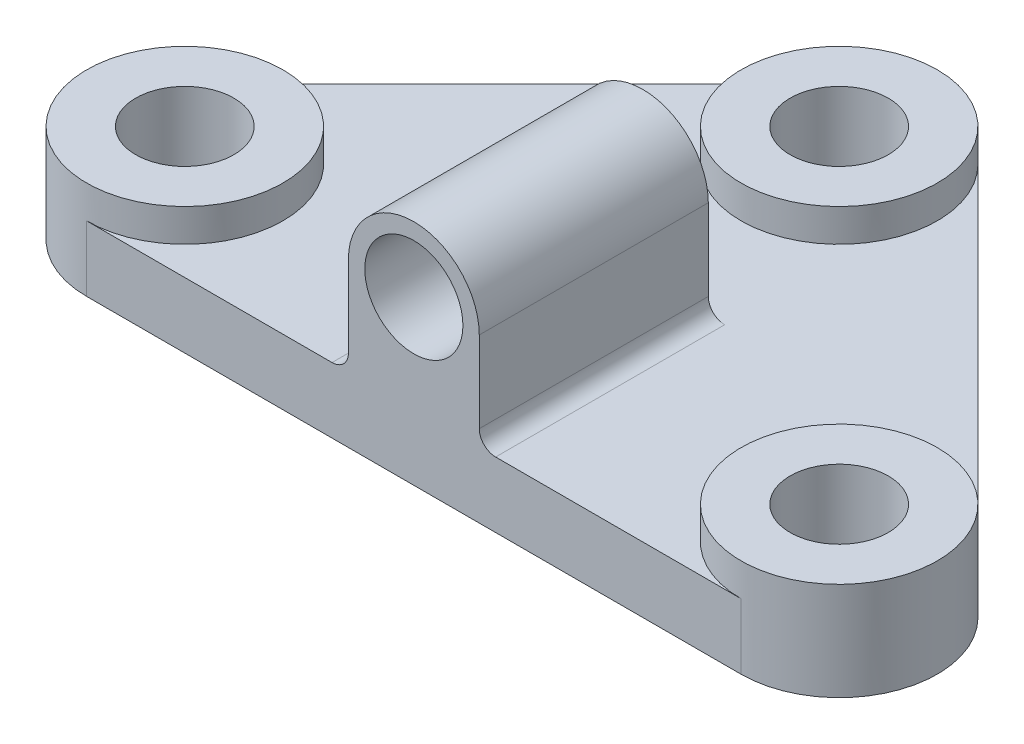
ISO-10303-21;
HEADER;
FILE_DESCRIPTION(('STEP AP214'),'2;1');
FILE_NAME('part.step','',(''),(''),'','','');
FILE_SCHEMA(('AUTOMOTIVE_DESIGN { 1 0 10303 214 1 1 1 1 }'));
ENDSEC;
DATA;
#1=APPLICATION_CONTEXT('core data for automotive mechanical design processes');
#2=APPLICATION_PROTOCOL_DEFINITION('international standard','automotive_design',2000,#1);
#3=PRODUCT_CONTEXT('',#1,'mechanical');
#4=PRODUCT('Part','Part','',(#3));
#5=PRODUCT_RELATED_PRODUCT_CATEGORY('part','',(#4));
#6=PRODUCT_DEFINITION_FORMATION('','',#4);
#7=PRODUCT_DEFINITION_CONTEXT('part definition',#1,'design');
#8=PRODUCT_DEFINITION('design','',#6,#7);
#9=PRODUCT_DEFINITION_SHAPE('','',#8);
#10=(LENGTH_UNIT() NAMED_UNIT(*) SI_UNIT(.MILLI.,.METRE.));
#11=(NAMED_UNIT(*) PLANE_ANGLE_UNIT() SI_UNIT($,.RADIAN.));
#12=(NAMED_UNIT(*) SI_UNIT($,.STERADIAN.) SOLID_ANGLE_UNIT());
#13=UNCERTAINTY_MEASURE_WITH_UNIT(LENGTH_MEASURE(1.E-05),#10,'distance_accuracy_value','');
#14=(GEOMETRIC_REPRESENTATION_CONTEXT(3) GLOBAL_UNCERTAINTY_ASSIGNED_CONTEXT((#13)) GLOBAL_UNIT_ASSIGNED_CONTEXT((#10,
#11,#12)) REPRESENTATION_CONTEXT('',''));
#15=CARTESIAN_POINT('',(0.,0.,0.));
#16=DIRECTION('',(0.,0.,1.));
#17=DIRECTION('',(1.,0.,0.));
#18=AXIS2_PLACEMENT_3D('',#15,#16,#17);
#19=CARTESIAN_POINT('',(21.2132034355964,20.,-121.213203435596));
#20=DIRECTION('',(0.707106781186547,0.,-0.707106781186548));
#21=DIRECTION('',(-0.707106781186548,0.,-0.707106781186547));
#22=AXIS2_PLACEMENT_3D('',#19,#20,#21);
#23=PLANE('',#22);
#24=DIRECTION('',(0.707106781186548,0.,0.707106781186547));
#25=VECTOR('',#24,1.);
#26=CARTESIAN_POINT('',(21.2132034355964,0.,-121.213203435596));
#27=LINE('',#26,#25);
#28=CARTESIAN_POINT('',(21.2132034355964,0.,-121.213203435596));
#29=VERTEX_POINT('',#28);
#30=CARTESIAN_POINT('',(121.213203435596,0.,-21.2132034355965));
#31=VERTEX_POINT('',#30);
#32=EDGE_CURVE('E174',#29,#31,#27,.T.);
#33=ORIENTED_EDGE('',*,*,#32,.F.);
#34=DIRECTION('',(0.,-1.,0.));
#35=VECTOR('',#34,1.);
#36=CARTESIAN_POINT('',(21.2132034355964,20.,-121.213203435596));
#37=LINE('',#36,#35);
#38=CARTESIAN_POINT('',(21.2132034355964,20.,-121.213203435596));
#39=VERTEX_POINT('',#38);
#40=EDGE_CURVE('E222',#39,#29,#37,.T.);
#41=ORIENTED_EDGE('',*,*,#40,.F.);
#42=DIRECTION('',(0.707106781186548,0.,0.707106781186547));
#43=VECTOR('',#42,1.);
#44=CARTESIAN_POINT('',(21.2132034355964,20.,-121.213203435596));
#45=LINE('',#44,#43);
#46=CARTESIAN_POINT('',(121.213203435596,20.,-21.2132034355965));
#47=VERTEX_POINT('',#46);
#48=EDGE_CURVE('E197',#39,#47,#45,.T.);
#49=ORIENTED_EDGE('',*,*,#48,.T.);
#50=DIRECTION('',(0.,-1.,0.));
#51=VECTOR('',#50,1.);
#52=CARTESIAN_POINT('',(121.213203435596,20.,-21.2132034355965));
#53=LINE('',#52,#51);
#54=EDGE_CURVE('E215',#47,#31,#53,.T.);
#55=ORIENTED_EDGE('',*,*,#54,.T.);
#56=EDGE_LOOP('',(#33,#41,#49,#55));
#57=FACE_BOUND('',#56,.T.);
#58=ADVANCED_FACE('F39',(#57),#23,.T.);
#59=CARTESIAN_POINT('',(-121.213203435596,20.,-21.2132034355964));
#60=DIRECTION('',(-0.707106781186548,0.,-0.707106781186548));
#61=DIRECTION('',(-0.707106781186548,0.,0.707106781186548));
#62=AXIS2_PLACEMENT_3D('',#59,#60,#61);
#63=PLANE('',#62);
#64=DIRECTION('',(0.707106781186547,0.,-0.707106781186547));
#65=VECTOR('',#64,1.);
#66=CARTESIAN_POINT('',(-121.213203435596,0.,-21.2132034355964));
#67=LINE('',#66,#65);
#68=CARTESIAN_POINT('',(-121.213203435596,0.,-21.2132034355964));
#69=VERTEX_POINT('',#68);
#70=CARTESIAN_POINT('',(-21.2132034355964,0.,-121.213203435596));
#71=VERTEX_POINT('',#70);
#72=EDGE_CURVE('E201',#69,#71,#67,.T.);
#73=ORIENTED_EDGE('',*,*,#72,.F.);
#74=DIRECTION('',(0.,-1.,0.));
#75=VECTOR('',#74,1.);
#76=CARTESIAN_POINT('',(-121.213203435596,20.,-21.2132034355964));
#77=LINE('',#76,#75);
#78=CARTESIAN_POINT('',(-121.213203435596,20.,-21.2132034355964));
#79=VERTEX_POINT('',#78);
#80=EDGE_CURVE('E229',#79,#69,#77,.T.);
#81=ORIENTED_EDGE('',*,*,#80,.F.);
#82=DIRECTION('',(0.707106781186547,0.,-0.707106781186547));
#83=VECTOR('',#82,1.);
#84=CARTESIAN_POINT('',(-121.213203435596,20.,-21.2132034355964));
#85=LINE('',#84,#83);
#86=CARTESIAN_POINT('',(-21.2132034355964,20.,-121.213203435596));
#87=VERTEX_POINT('',#86);
#88=EDGE_CURVE('E210',#79,#87,#85,.T.);
#89=ORIENTED_EDGE('',*,*,#88,.T.);
#90=DIRECTION('',(0.,-1.,0.));
#91=VECTOR('',#90,1.);
#92=CARTESIAN_POINT('',(-21.2132034355964,20.,-121.213203435596));
#93=LINE('',#92,#91);
#94=EDGE_CURVE('E226',#87,#71,#93,.T.);
#95=ORIENTED_EDGE('',*,*,#94,.T.);
#96=EDGE_LOOP('',(#73,#81,#89,#95));
#97=FACE_BOUND('',#96,.T.);
#98=ADVANCED_FACE('F269',(#97),#63,.T.);
#99=CARTESIAN_POINT('',(-100.,20.,30.));
#100=DIRECTION('',(0.,0.,-1.));
#101=DIRECTION('',(-1.,0.,0.));
#102=AXIS2_PLACEMENT_3D('',#99,#100,#101);
#103=PLANE('',#102);
#104=DIRECTION('',(1.,0.,0.));
#105=VECTOR('',#104,1.);
#106=CARTESIAN_POINT('',(-100.,0.,30.));
#107=LINE('',#106,#105);
#108=CARTESIAN_POINT('',(-100.,0.,30.));
#109=VERTEX_POINT('',#108);
#110=CARTESIAN_POINT('',(100.,0.,30.));
#111=VERTEX_POINT('',#110);
#112=EDGE_CURVE('E218',#109,#111,#107,.T.);
#113=ORIENTED_EDGE('',*,*,#112,.T.);
#114=DIRECTION('',(0.,-1.,0.));
#115=VECTOR('',#114,1.);
#116=CARTESIAN_POINT('',(100.,20.,30.));
#117=LINE('',#116,#115);
#118=CARTESIAN_POINT('',(100.,20.,30.));
#119=VERTEX_POINT('',#118);
#120=EDGE_CURVE('E235',#119,#111,#117,.T.);
#121=ORIENTED_EDGE('',*,*,#120,.F.);
#122=DIRECTION('',(1.,0.,0.));
#123=VECTOR('',#122,1.);
#124=CARTESIAN_POINT('',(-100.,20.,30.));
#125=LINE('',#124,#123);
#126=CARTESIAN_POINT('',(25.,20.,30.));
#127=VERTEX_POINT('',#126);
#128=EDGE_CURVE('E204',#127,#119,#125,.T.);
#129=ORIENTED_EDGE('',*,*,#128,.F.);
#130=CARTESIAN_POINT('',(25.,25.,30.));
#131=DIRECTION('',(0.,0.,-1.));
#132=DIRECTION('',(-1.,0.,0.));
#133=AXIS2_PLACEMENT_3D('',#130,#131,#132);
#134=CIRCLE('',#133,5.);
#135=CARTESIAN_POINT('',(20.,25.,30.));
#136=VERTEX_POINT('',#135);
#137=EDGE_CURVE('E252',#127,#136,#134,.T.);
#138=ORIENTED_EDGE('',*,*,#137,.T.);
#139=DIRECTION('',(0.,1.,0.));
#140=VECTOR('',#139,1.);
#141=CARTESIAN_POINT('',(20.,49.8,30.));
#142=LINE('',#141,#140);
#143=CARTESIAN_POINT('',(20.,49.8,30.));
#144=VERTEX_POINT('',#143);
#145=EDGE_CURVE('E147',#136,#144,#142,.T.);
#146=ORIENTED_EDGE('',*,*,#145,.T.);
#147=CARTESIAN_POINT('',(0.,49.8,30.));
#148=DIRECTION('',(0.,0.,1.));
#149=DIRECTION('',(1.,0.,0.));
#150=AXIS2_PLACEMENT_3D('',#147,#148,#149);
#151=CIRCLE('',#150,20.);
#152=CARTESIAN_POINT('',(-20.,49.8,30.));
#153=VERTEX_POINT('',#152);
#154=EDGE_CURVE('E155',#144,#153,#151,.T.);
#155=ORIENTED_EDGE('',*,*,#154,.T.);
#156=DIRECTION('',(0.,-1.,0.));
#157=VECTOR('',#156,1.);
#158=CARTESIAN_POINT('',(-20.,49.8,30.));
#159=LINE('',#158,#157);
#160=CARTESIAN_POINT('',(-20.,25.,30.));
#161=VERTEX_POINT('',#160);
#162=EDGE_CURVE('E130',#153,#161,#159,.T.);
#163=ORIENTED_EDGE('',*,*,#162,.T.);
#164=CARTESIAN_POINT('',(-25.,25.,30.));
#165=DIRECTION('',(0.,0.,-1.));
#166=DIRECTION('',(-1.,0.,0.));
#167=AXIS2_PLACEMENT_3D('',#164,#165,#166);
#168=CIRCLE('',#167,5.);
#169=CARTESIAN_POINT('',(-25.,20.,30.));
#170=VERTEX_POINT('',#169);
#171=EDGE_CURVE('E47',#161,#170,#168,.T.);
#172=ORIENTED_EDGE('',*,*,#171,.T.);
#173=CARTESIAN_POINT('',(-100.,20.,30.));
#174=VERTEX_POINT('',#173);
#175=EDGE_CURVE('E205',#174,#170,#125,.T.);
#176=ORIENTED_EDGE('',*,*,#175,.F.);
#177=DIRECTION('',(0.,-1.,0.));
#178=VECTOR('',#177,1.);
#179=CARTESIAN_POINT('',(-100.,20.,30.));
#180=LINE('',#179,#178);
#181=EDGE_CURVE('E232',#174,#109,#180,.T.);
#182=ORIENTED_EDGE('',*,*,#181,.T.);
#183=EDGE_LOOP('',(#113,#121,#129,#138,#146,#155,#163,#172,#176,#182));
#184=FACE_BOUND('',#183,.T.);
#185=CARTESIAN_POINT('',(0.,49.8,30.));
#186=DIRECTION('',(0.,0.,1.));
#187=DIRECTION('',(1.,0.,0.));
#188=AXIS2_PLACEMENT_3D('',#185,#186,#187);
#189=CIRCLE('',#188,15.);
#190=CARTESIAN_POINT('',(15.,49.8,30.));
#191=VERTEX_POINT('',#190);
#192=EDGE_CURVE('E151',#191,#191,#189,.T.);
#193=ORIENTED_EDGE('',*,*,#192,.F.);
#194=EDGE_LOOP('',(#193));
#195=FACE_BOUND('',#194,.T.);
#196=ADVANCED_FACE('F255',(#184,#195),#103,.F.);
#197=CARTESIAN_POINT('',(100.,20.,0.));
#198=DIRECTION('',(0.,1.,0.));
#199=DIRECTION('',(0.,0.,1.));
#200=AXIS2_PLACEMENT_3D('',#197,#198,#199);
#201=PLANE('',#200);
#202=DIRECTION('',(1.,0.,0.));
#203=VECTOR('',#202,1.);
#204=CARTESIAN_POINT('',(100.,20.,-40.));
#205=LINE('',#204,#203);
#206=CARTESIAN_POINT('',(-25.,20.,-40.));
#207=VERTEX_POINT('',#206);
#208=CARTESIAN_POINT('',(25.,20.,-40.));
#209=VERTEX_POINT('',#208);
#210=EDGE_CURVE('E159',#207,#209,#205,.T.);
#211=ORIENTED_EDGE('',*,*,#210,.T.);
#212=DIRECTION('',(0.,0.,-1.));
#213=VECTOR('',#212,1.);
#214=CARTESIAN_POINT('',(25.,20.,30.));
#215=LINE('',#214,#213);
#216=EDGE_CURVE('E245',#209,#127,#215,.F.);
#217=ORIENTED_EDGE('',*,*,#216,.T.);
#218=ORIENTED_EDGE('',*,*,#128,.T.);
#219=CARTESIAN_POINT('',(100.,20.,0.));
#220=DIRECTION('',(0.,1.,0.));
#221=DIRECTION('',(0.,0.,1.));
#222=AXIS2_PLACEMENT_3D('',#219,#220,#221);
#223=CIRCLE('',#222,30.);
#224=EDGE_CURVE('E200',#47,#119,#223,.T.);
#225=ORIENTED_EDGE('',*,*,#224,.F.);
#226=ORIENTED_EDGE('',*,*,#48,.F.);
#227=CARTESIAN_POINT('',(0.,20.,-100.));
#228=DIRECTION('',(0.,1.,0.));
#229=DIRECTION('',(0.,0.,1.));
#230=AXIS2_PLACEMENT_3D('',#227,#228,#229);
#231=CIRCLE('',#230,30.);
#232=EDGE_CURVE('E213',#87,#39,#231,.T.);
#233=ORIENTED_EDGE('',*,*,#232,.F.);
#234=ORIENTED_EDGE('',*,*,#88,.F.);
#235=CARTESIAN_POINT('',(-100.,20.,0.));
#236=DIRECTION('',(0.,1.,0.));
#237=DIRECTION('',(0.,0.,1.));
#238=AXIS2_PLACEMENT_3D('',#235,#236,#237);
#239=CIRCLE('',#238,30.);
#240=EDGE_CURVE('E208',#174,#79,#239,.T.);
#241=ORIENTED_EDGE('',*,*,#240,.F.);
#242=ORIENTED_EDGE('',*,*,#175,.T.);
#243=DIRECTION('',(0.,0.,1.));
#244=VECTOR('',#243,1.);
#245=CARTESIAN_POINT('',(-25.,20.,-40.));
#246=LINE('',#245,#244);
#247=EDGE_CURVE('E242',#170,#207,#246,.F.);
#248=ORIENTED_EDGE('',*,*,#247,.T.);
#249=EDGE_LOOP('',(#211,#217,#218,#225,#226,#233,#234,#241,#242,#248));
#250=FACE_BOUND('',#249,.T.);
#251=ADVANCED_FACE('F259',(#250),#201,.T.);
#252=CARTESIAN_POINT('',(100.,0.,0.));
#253=DIRECTION('',(0.,1.,0.));
#254=DIRECTION('',(0.,0.,1.));
#255=AXIS2_PLACEMENT_3D('',#252,#253,#254);
#256=PLANE('',#255);
#257=CARTESIAN_POINT('',(100.,0.,0.));
#258=DIRECTION('',(0.,-1.,0.));
#259=DIRECTION('',(0.,0.,-1.));
#260=AXIS2_PLACEMENT_3D('',#257,#258,#259);
#261=CIRCLE('',#260,30.);
#262=EDGE_CURVE('E176',#31,#111,#261,.T.);
#263=ORIENTED_EDGE('',*,*,#262,.T.);
#264=ORIENTED_EDGE('',*,*,#112,.F.);
#265=CARTESIAN_POINT('',(-100.,0.,0.));
#266=DIRECTION('',(0.,-1.,0.));
#267=DIRECTION('',(0.,0.,-1.));
#268=AXIS2_PLACEMENT_3D('',#265,#266,#267);
#269=CIRCLE('',#268,30.);
#270=EDGE_CURVE('E188',#109,#69,#269,.T.);
#271=ORIENTED_EDGE('',*,*,#270,.T.);
#272=ORIENTED_EDGE('',*,*,#72,.T.);
#273=CARTESIAN_POINT('',(0.,0.,-100.));
#274=DIRECTION('',(0.,-1.,0.));
#275=DIRECTION('',(0.,0.,-1.));
#276=AXIS2_PLACEMENT_3D('',#273,#274,#275);
#277=CIRCLE('',#276,30.);
#278=EDGE_CURVE('E166',#71,#29,#277,.T.);
#279=ORIENTED_EDGE('',*,*,#278,.T.);
#280=ORIENTED_EDGE('',*,*,#32,.T.);
#281=EDGE_LOOP('',(#263,#264,#271,#272,#279,#280));
#282=FACE_BOUND('',#281,.T.);
#283=CARTESIAN_POINT('',(-100.,0.,0.));
#284=DIRECTION('',(0.,-1.,0.));
#285=DIRECTION('',(0.,0.,-1.));
#286=AXIS2_PLACEMENT_3D('',#283,#284,#285);
#287=CIRCLE('',#286,15.);
#288=CARTESIAN_POINT('',(-100.,0.,-15.));
#289=VERTEX_POINT('',#288);
#290=EDGE_CURVE('E183',#289,#289,#287,.T.);
#291=ORIENTED_EDGE('',*,*,#290,.F.);
#292=EDGE_LOOP('',(#291));
#293=FACE_BOUND('',#292,.T.);
#294=CARTESIAN_POINT('',(100.,0.,0.));
#295=DIRECTION('',(0.,-1.,0.));
#296=DIRECTION('',(0.,0.,-1.));
#297=AXIS2_PLACEMENT_3D('',#294,#295,#296);
#298=CIRCLE('',#297,15.);
#299=CARTESIAN_POINT('',(100.,0.,-15.));
#300=VERTEX_POINT('',#299);
#301=EDGE_CURVE('E170',#300,#300,#298,.T.);
#302=ORIENTED_EDGE('',*,*,#301,.F.);
#303=EDGE_LOOP('',(#302));
#304=FACE_BOUND('',#303,.T.);
#305=CARTESIAN_POINT('',(0.,0.,-100.));
#306=DIRECTION('',(0.,-1.,0.));
#307=DIRECTION('',(0.,0.,-1.));
#308=AXIS2_PLACEMENT_3D('',#305,#306,#307);
#309=CIRCLE('',#308,15.);
#310=CARTESIAN_POINT('',(0.,0.,-115.));
#311=VERTEX_POINT('',#310);
#312=EDGE_CURVE('E167',#311,#311,#309,.T.);
#313=ORIENTED_EDGE('',*,*,#312,.F.);
#314=EDGE_LOOP('',(#313));
#315=FACE_BOUND('',#314,.T.);
#316=ADVANCED_FACE('F281',(#282,#293,#304,#315),#256,.F.);
#317=CARTESIAN_POINT('',(-100.,30.,0.));
#318=DIRECTION('',(0.,-1.,0.));
#319=DIRECTION('',(0.,0.,-1.));
#320=AXIS2_PLACEMENT_3D('',#317,#318,#319);
#321=CYLINDRICAL_SURFACE('',#320,30.);
#322=ORIENTED_EDGE('',*,*,#240,.T.);
#323=ORIENTED_EDGE('',*,*,#80,.T.);
#324=ORIENTED_EDGE('',*,*,#270,.F.);
#325=ORIENTED_EDGE('',*,*,#181,.F.);
#326=EDGE_LOOP('',(#322,#323,#324,#325));
#327=FACE_BOUND('',#326,.T.);
#328=CARTESIAN_POINT('',(-100.,30.,0.));
#329=DIRECTION('',(0.,-1.,0.));
#330=DIRECTION('',(0.,0.,-1.));
#331=AXIS2_PLACEMENT_3D('',#328,#329,#330);
#332=CIRCLE('',#331,30.);
#333=CARTESIAN_POINT('',(-100.,30.,-30.));
#334=VERTEX_POINT('',#333);
#335=EDGE_CURVE('E162',#334,#334,#332,.T.);
#336=ORIENTED_EDGE('',*,*,#335,.T.);
#337=EDGE_LOOP('',(#336));
#338=FACE_BOUND('',#337,.T.);
#339=ADVANCED_FACE('F284',(#327,#338),#321,.T.);
#340=CARTESIAN_POINT('',(-100.,30.,0.));
#341=DIRECTION('',(0.,-1.,0.));
#342=DIRECTION('',(0.,0.,-1.));
#343=AXIS2_PLACEMENT_3D('',#340,#341,#342);
#344=PLANE('',#343);
#345=CARTESIAN_POINT('',(-100.,30.,0.));
#346=DIRECTION('',(0.,-1.,0.));
#347=DIRECTION('',(0.,0.,-1.));
#348=AXIS2_PLACEMENT_3D('',#345,#346,#347);
#349=CIRCLE('',#348,15.);
#350=CARTESIAN_POINT('',(-100.,30.,-15.));
#351=VERTEX_POINT('',#350);
#352=EDGE_CURVE('E190',#351,#351,#349,.T.);
#353=ORIENTED_EDGE('',*,*,#352,.T.);
#354=EDGE_LOOP('',(#353));
#355=FACE_BOUND('',#354,.T.);
#356=ORIENTED_EDGE('',*,*,#335,.F.);
#357=EDGE_LOOP('',(#356));
#358=FACE_BOUND('',#357,.T.);
#359=ADVANCED_FACE('F292',(#355,#358),#344,.F.);
#360=CARTESIAN_POINT('',(-100.,30.,0.));
#361=DIRECTION('',(0.,-1.,0.));
#362=DIRECTION('',(0.,0.,-1.));
#363=AXIS2_PLACEMENT_3D('',#360,#361,#362);
#364=CYLINDRICAL_SURFACE('',#363,15.);
#365=ORIENTED_EDGE('',*,*,#352,.F.);
#366=EDGE_LOOP('',(#365));
#367=FACE_BOUND('',#366,.T.);
#368=ORIENTED_EDGE('',*,*,#290,.T.);
#369=EDGE_LOOP('',(#368));
#370=FACE_BOUND('',#369,.T.);
#371=ADVANCED_FACE('F288',(#367,#370),#364,.F.);
#372=CARTESIAN_POINT('',(100.,30.,0.));
#373=DIRECTION('',(0.,-1.,0.));
#374=DIRECTION('',(0.,0.,-1.));
#375=AXIS2_PLACEMENT_3D('',#372,#373,#374);
#376=CYLINDRICAL_SURFACE('',#375,30.);
#377=CARTESIAN_POINT('',(100.,30.,0.));
#378=DIRECTION('',(0.,-1.,0.));
#379=DIRECTION('',(0.,0.,-1.));
#380=AXIS2_PLACEMENT_3D('',#377,#378,#379);
#381=CIRCLE('',#380,30.);
#382=CARTESIAN_POINT('',(100.,30.,-30.));
#383=VERTEX_POINT('',#382);
#384=EDGE_CURVE('E180',#383,#383,#381,.T.);
#385=ORIENTED_EDGE('',*,*,#384,.T.);
#386=EDGE_LOOP('',(#385));
#387=FACE_BOUND('',#386,.T.);
#388=ORIENTED_EDGE('',*,*,#54,.F.);
#389=ORIENTED_EDGE('',*,*,#224,.T.);
#390=ORIENTED_EDGE('',*,*,#120,.T.);
#391=ORIENTED_EDGE('',*,*,#262,.F.);
#392=EDGE_LOOP('',(#388,#389,#390,#391));
#393=FACE_BOUND('',#392,.T.);
#394=ADVANCED_FACE('F291',(#387,#393),#376,.T.);
#395=CARTESIAN_POINT('',(100.,30.,0.));
#396=DIRECTION('',(0.,-1.,0.));
#397=DIRECTION('',(0.,0.,-1.));
#398=AXIS2_PLACEMENT_3D('',#395,#396,#397);
#399=PLANE('',#398);
#400=CARTESIAN_POINT('',(100.,30.,0.));
#401=DIRECTION('',(0.,-1.,0.));
#402=DIRECTION('',(0.,0.,-1.));
#403=AXIS2_PLACEMENT_3D('',#400,#401,#402);
#404=CIRCLE('',#403,15.);
#405=CARTESIAN_POINT('',(100.,30.,-15.));
#406=VERTEX_POINT('',#405);
#407=EDGE_CURVE('E179',#406,#406,#404,.T.);
#408=ORIENTED_EDGE('',*,*,#407,.T.);
#409=EDGE_LOOP('',(#408));
#410=FACE_BOUND('',#409,.T.);
#411=ORIENTED_EDGE('',*,*,#384,.F.);
#412=EDGE_LOOP('',(#411));
#413=FACE_BOUND('',#412,.T.);
#414=ADVANCED_FACE('F304',(#410,#413),#399,.F.);
#415=CARTESIAN_POINT('',(100.,30.,0.));
#416=DIRECTION('',(0.,-1.,0.));
#417=DIRECTION('',(0.,0.,-1.));
#418=AXIS2_PLACEMENT_3D('',#415,#416,#417);
#419=CYLINDRICAL_SURFACE('',#418,15.);
#420=ORIENTED_EDGE('',*,*,#407,.F.);
#421=EDGE_LOOP('',(#420));
#422=FACE_BOUND('',#421,.T.);
#423=ORIENTED_EDGE('',*,*,#301,.T.);
#424=EDGE_LOOP('',(#423));
#425=FACE_BOUND('',#424,.T.);
#426=ADVANCED_FACE('F300',(#422,#425),#419,.F.);
#427=CARTESIAN_POINT('',(0.,30.,-100.));
#428=DIRECTION('',(0.,-1.,0.));
#429=DIRECTION('',(0.,0.,-1.));
#430=AXIS2_PLACEMENT_3D('',#427,#428,#429);
#431=CYLINDRICAL_SURFACE('',#430,30.);
#432=ORIENTED_EDGE('',*,*,#232,.T.);
#433=ORIENTED_EDGE('',*,*,#40,.T.);
#434=ORIENTED_EDGE('',*,*,#278,.F.);
#435=ORIENTED_EDGE('',*,*,#94,.F.);
#436=EDGE_LOOP('',(#432,#433,#434,#435));
#437=FACE_BOUND('',#436,.T.);
#438=CARTESIAN_POINT('',(0.,30.,-100.));
#439=DIRECTION('',(0.,-1.,0.));
#440=DIRECTION('',(0.,0.,-1.));
#441=AXIS2_PLACEMENT_3D('',#438,#439,#440);
#442=CIRCLE('',#441,30.);
#443=CARTESIAN_POINT('',(0.,30.,-130.));
#444=VERTEX_POINT('',#443);
#445=EDGE_CURVE('E171',#444,#444,#442,.T.);
#446=ORIENTED_EDGE('',*,*,#445,.T.);
#447=EDGE_LOOP('',(#446));
#448=FACE_BOUND('',#447,.T.);
#449=ADVANCED_FACE('F303',(#437,#448),#431,.T.);
#450=CARTESIAN_POINT('',(0.,30.,-100.));
#451=DIRECTION('',(0.,-1.,0.));
#452=DIRECTION('',(0.,0.,-1.));
#453=AXIS2_PLACEMENT_3D('',#450,#451,#452);
#454=PLANE('',#453);
#455=CARTESIAN_POINT('',(0.,30.,-100.));
#456=DIRECTION('',(0.,-1.,0.));
#457=DIRECTION('',(0.,0.,-1.));
#458=AXIS2_PLACEMENT_3D('',#455,#456,#457);
#459=CIRCLE('',#458,15.);
#460=CARTESIAN_POINT('',(0.,30.,-115.));
#461=VERTEX_POINT('',#460);
#462=EDGE_CURVE('E163',#461,#461,#459,.T.);
#463=ORIENTED_EDGE('',*,*,#462,.T.);
#464=EDGE_LOOP('',(#463));
#465=FACE_BOUND('',#464,.T.);
#466=ORIENTED_EDGE('',*,*,#445,.F.);
#467=EDGE_LOOP('',(#466));
#468=FACE_BOUND('',#467,.T.);
#469=ADVANCED_FACE('F314',(#465,#468),#454,.F.);
#470=CARTESIAN_POINT('',(0.,30.,-100.));
#471=DIRECTION('',(0.,-1.,0.));
#472=DIRECTION('',(0.,0.,-1.));
#473=AXIS2_PLACEMENT_3D('',#470,#471,#472);
#474=CYLINDRICAL_SURFACE('',#473,15.);
#475=ORIENTED_EDGE('',*,*,#462,.F.);
#476=EDGE_LOOP('',(#475));
#477=FACE_BOUND('',#476,.T.);
#478=ORIENTED_EDGE('',*,*,#312,.T.);
#479=EDGE_LOOP('',(#478));
#480=FACE_BOUND('',#479,.T.);
#481=ADVANCED_FACE('F318',(#477,#480),#474,.F.);
#482=CARTESIAN_POINT('',(0.,49.8,-40.));
#483=DIRECTION('',(0.,0.,1.));
#484=DIRECTION('',(1.,0.,0.));
#485=AXIS2_PLACEMENT_3D('',#482,#483,#484);
#486=CYLINDRICAL_SURFACE('',#485,20.);
#487=ORIENTED_EDGE('',*,*,#154,.F.);
#488=DIRECTION('',(0.,0.,1.));
#489=VECTOR('',#488,1.);
#490=CARTESIAN_POINT('',(20.,49.8,-40.));
#491=LINE('',#490,#489);
#492=CARTESIAN_POINT('',(20.,49.8,-40.));
#493=VERTEX_POINT('',#492);
#494=EDGE_CURVE('E135',#493,#144,#491,.T.);
#495=ORIENTED_EDGE('',*,*,#494,.F.);
#496=CARTESIAN_POINT('',(0.,49.8,-40.));
#497=DIRECTION('',(0.,0.,1.));
#498=DIRECTION('',(1.,0.,0.));
#499=AXIS2_PLACEMENT_3D('',#496,#497,#498);
#500=CIRCLE('',#499,20.);
#501=CARTESIAN_POINT('',(-20.,49.8,-40.));
#502=VERTEX_POINT('',#501);
#503=EDGE_CURVE('E142',#493,#502,#500,.T.);
#504=ORIENTED_EDGE('',*,*,#503,.T.);
#505=DIRECTION('',(0.,0.,1.));
#506=VECTOR('',#505,1.);
#507=CARTESIAN_POINT('',(-20.,49.8,-40.));
#508=LINE('',#507,#506);
#509=EDGE_CURVE('E126',#502,#153,#508,.T.);
#510=ORIENTED_EDGE('',*,*,#509,.T.);
#511=EDGE_LOOP('',(#487,#495,#504,#510));
#512=FACE_BOUND('',#511,.T.);
#513=ADVANCED_FACE('F145',(#512),#486,.T.);
#514=CARTESIAN_POINT('',(20.,49.8,-40.));
#515=DIRECTION('',(1.,0.,0.));
#516=DIRECTION('',(0.,1.,0.));
#517=AXIS2_PLACEMENT_3D('',#514,#515,#516);
#518=PLANE('',#517);
#519=ORIENTED_EDGE('',*,*,#145,.F.);
#520=DIRECTION('',(0.,0.,-1.));
#521=VECTOR('',#520,1.);
#522=CARTESIAN_POINT('',(20.,25.,-40.));
#523=LINE('',#522,#521);
#524=CARTESIAN_POINT('',(20.,25.,-40.));
#525=VERTEX_POINT('',#524);
#526=EDGE_CURVE('E225',#136,#525,#523,.T.);
#527=ORIENTED_EDGE('',*,*,#526,.T.);
#528=DIRECTION('',(0.,1.,0.));
#529=VECTOR('',#528,1.);
#530=CARTESIAN_POINT('',(20.,49.8,-40.));
#531=LINE('',#530,#529);
#532=EDGE_CURVE('E136',#525,#493,#531,.T.);
#533=ORIENTED_EDGE('',*,*,#532,.T.);
#534=ORIENTED_EDGE('',*,*,#494,.T.);
#535=EDGE_LOOP('',(#519,#527,#533,#534));
#536=FACE_BOUND('',#535,.T.);
#537=ADVANCED_FACE('F325',(#536),#518,.T.);
#538=CARTESIAN_POINT('',(-20.,49.8,-40.));
#539=DIRECTION('',(-1.,0.,0.));
#540=DIRECTION('',(0.,-1.,0.));
#541=AXIS2_PLACEMENT_3D('',#538,#539,#540);
#542=PLANE('',#541);
#543=DIRECTION('',(0.,-1.,0.));
#544=VECTOR('',#543,1.);
#545=CARTESIAN_POINT('',(-20.,49.8,-40.));
#546=LINE('',#545,#544);
#547=CARTESIAN_POINT('',(-20.,25.,-40.));
#548=VERTEX_POINT('',#547);
#549=EDGE_CURVE('E128',#502,#548,#546,.T.);
#550=ORIENTED_EDGE('',*,*,#549,.T.);
#551=DIRECTION('',(0.,0.,1.));
#552=VECTOR('',#551,1.);
#553=CARTESIAN_POINT('',(-20.,25.,30.));
#554=LINE('',#553,#552);
#555=EDGE_CURVE('E247',#548,#161,#554,.T.);
#556=ORIENTED_EDGE('',*,*,#555,.T.);
#557=ORIENTED_EDGE('',*,*,#162,.F.);
#558=ORIENTED_EDGE('',*,*,#509,.F.);
#559=EDGE_LOOP('',(#550,#556,#557,#558));
#560=FACE_BOUND('',#559,.T.);
#561=ADVANCED_FACE('F127',(#560),#542,.T.);
#562=CARTESIAN_POINT('',(0.,49.8,-40.));
#563=DIRECTION('',(0.,0.,1.));
#564=DIRECTION('',(1.,0.,0.));
#565=AXIS2_PLACEMENT_3D('',#562,#563,#564);
#566=PLANE('',#565);
#567=ORIENTED_EDGE('',*,*,#210,.F.);
#568=CARTESIAN_POINT('',(-25.,25.,-40.));
#569=DIRECTION('',(0.,0.,1.));
#570=DIRECTION('',(1.,0.,0.));
#571=AXIS2_PLACEMENT_3D('',#568,#569,#570);
#572=CIRCLE('',#571,5.);
#573=EDGE_CURVE('E11',#207,#548,#572,.T.);
#574=ORIENTED_EDGE('',*,*,#573,.T.);
#575=ORIENTED_EDGE('',*,*,#549,.F.);
#576=ORIENTED_EDGE('',*,*,#503,.F.);
#577=ORIENTED_EDGE('',*,*,#532,.F.);
#578=CARTESIAN_POINT('',(25.,25.,-40.));
#579=DIRECTION('',(0.,0.,1.));
#580=DIRECTION('',(1.,0.,0.));
#581=AXIS2_PLACEMENT_3D('',#578,#579,#580);
#582=CIRCLE('',#581,5.);
#583=EDGE_CURVE('E249',#525,#209,#582,.T.);
#584=ORIENTED_EDGE('',*,*,#583,.T.);
#585=EDGE_LOOP('',(#567,#574,#575,#576,#577,#584));
#586=FACE_BOUND('',#585,.T.);
#587=CARTESIAN_POINT('',(0.,49.8,-40.));
#588=DIRECTION('',(0.,0.,1.));
#589=DIRECTION('',(1.,0.,0.));
#590=AXIS2_PLACEMENT_3D('',#587,#588,#589);
#591=CIRCLE('',#590,15.);
#592=CARTESIAN_POINT('',(15.,49.8,-40.));
#593=VERTEX_POINT('',#592);
#594=EDGE_CURVE('E157',#593,#593,#591,.T.);
#595=ORIENTED_EDGE('',*,*,#594,.T.);
#596=EDGE_LOOP('',(#595));
#597=FACE_BOUND('',#596,.T.);
#598=ADVANCED_FACE('F139',(#586,#597),#566,.F.);
#599=CARTESIAN_POINT('',(0.,49.8,-40.));
#600=DIRECTION('',(0.,0.,1.));
#601=DIRECTION('',(1.,0.,0.));
#602=AXIS2_PLACEMENT_3D('',#599,#600,#601);
#603=CYLINDRICAL_SURFACE('',#602,15.);
#604=ORIENTED_EDGE('',*,*,#594,.F.);
#605=EDGE_LOOP('',(#604));
#606=FACE_BOUND('',#605,.T.);
#607=ORIENTED_EDGE('',*,*,#192,.T.);
#608=EDGE_LOOP('',(#607));
#609=FACE_BOUND('',#608,.T.);
#610=ADVANCED_FACE('F266',(#606,#609),#603,.F.);
#611=CARTESIAN_POINT('',(25.,25.,-40.));
#612=DIRECTION('',(0.,0.,1.));
#613=DIRECTION('',(1.,0.,0.));
#614=AXIS2_PLACEMENT_3D('',#611,#612,#613);
#615=CYLINDRICAL_SURFACE('',#614,5.);
#616=ORIENTED_EDGE('',*,*,#137,.F.);
#617=ORIENTED_EDGE('',*,*,#216,.F.);
#618=ORIENTED_EDGE('',*,*,#583,.F.);
#619=ORIENTED_EDGE('',*,*,#526,.F.);
#620=EDGE_LOOP('',(#616,#617,#618,#619));
#621=FACE_BOUND('',#620,.T.);
#622=ADVANCED_FACE('F262',(#621),#615,.F.);
#623=CARTESIAN_POINT('',(-25.,25.,-40.));
#624=DIRECTION('',(0.,0.,-1.));
#625=DIRECTION('',(-1.,0.,0.));
#626=AXIS2_PLACEMENT_3D('',#623,#624,#625);
#627=CYLINDRICAL_SURFACE('',#626,5.);
#628=ORIENTED_EDGE('',*,*,#573,.F.);
#629=ORIENTED_EDGE('',*,*,#247,.F.);
#630=ORIENTED_EDGE('',*,*,#171,.F.);
#631=ORIENTED_EDGE('',*,*,#555,.F.);
#632=EDGE_LOOP('',(#628,#629,#630,#631));
#633=FACE_BOUND('',#632,.T.);
#634=ADVANCED_FACE('F41',(#633),#627,.F.);
#635=CLOSED_SHELL('',(#58,#98,#196,#251,#316,#339,#359,#371,#394,#414,#426,#449,#469,#481,#513,
#537,#561,#598,#610,#622,#634));
#636=MANIFOLD_SOLID_BREP('B2',#635);
#637=ADVANCED_BREP_SHAPE_REPRESENTATION('',(#18,#636),#14);
#638=SHAPE_DEFINITION_REPRESENTATION(#9,#637);
ENDSEC;
END-ISO-10303-21;
